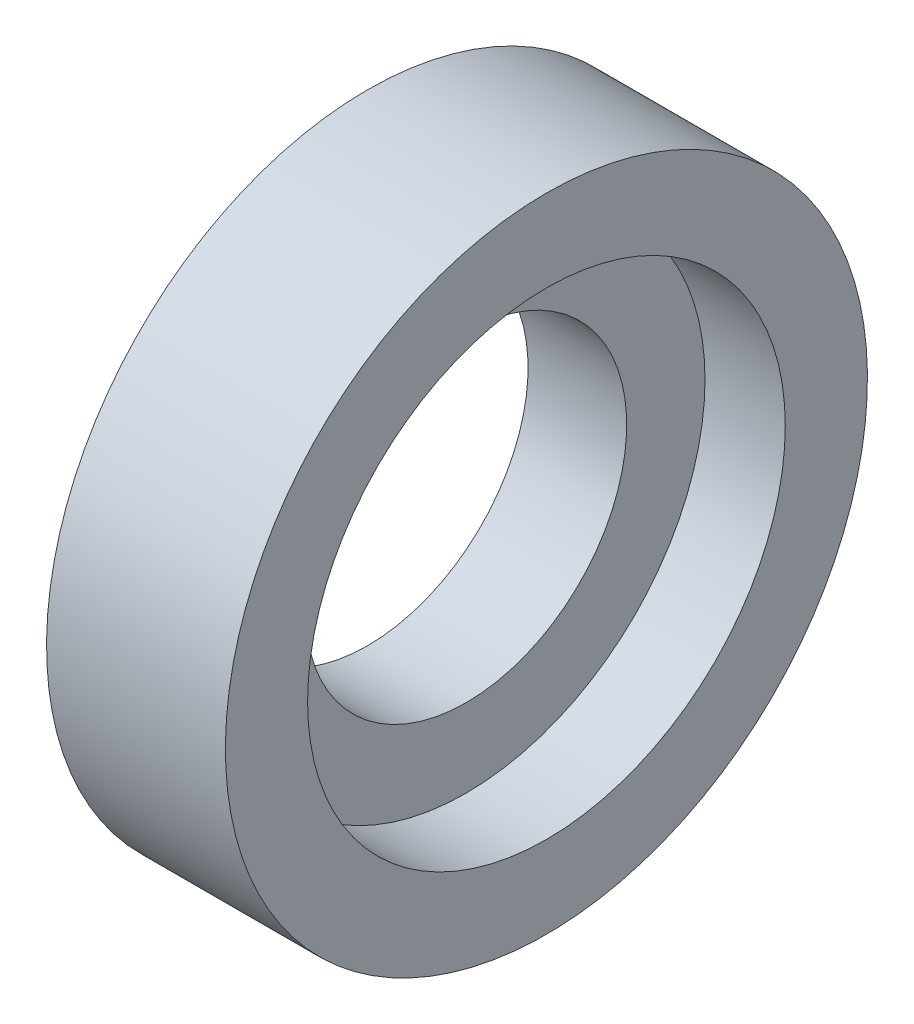
ISO-10303-21;
HEADER;
FILE_DESCRIPTION(('STEP AP214'),'2;1');
FILE_NAME('part.step','',(''),(''),'','','');
FILE_SCHEMA(('AUTOMOTIVE_DESIGN { 1 0 10303 214 1 1 1 1 }'));
ENDSEC;
DATA;
#1=APPLICATION_CONTEXT('core data for automotive mechanical design processes');
#2=APPLICATION_PROTOCOL_DEFINITION('international standard','automotive_design',2000,#1);
#3=PRODUCT_CONTEXT('',#1,'mechanical');
#4=PRODUCT('Part','Part','',(#3));
#5=PRODUCT_RELATED_PRODUCT_CATEGORY('part','',(#4));
#6=PRODUCT_DEFINITION_FORMATION('','',#4);
#7=PRODUCT_DEFINITION_CONTEXT('part definition',#1,'design');
#8=PRODUCT_DEFINITION('design','',#6,#7);
#9=PRODUCT_DEFINITION_SHAPE('','',#8);
#10=(LENGTH_UNIT() NAMED_UNIT(*) SI_UNIT(.MILLI.,.METRE.));
#11=(NAMED_UNIT(*) PLANE_ANGLE_UNIT() SI_UNIT($,.RADIAN.));
#12=(NAMED_UNIT(*) SI_UNIT($,.STERADIAN.) SOLID_ANGLE_UNIT());
#13=UNCERTAINTY_MEASURE_WITH_UNIT(LENGTH_MEASURE(1.E-05),#10,'distance_accuracy_value','');
#14=(GEOMETRIC_REPRESENTATION_CONTEXT(3) GLOBAL_UNCERTAINTY_ASSIGNED_CONTEXT((#13)) GLOBAL_UNIT_ASSIGNED_CONTEXT((#10,
#11,#12)) REPRESENTATION_CONTEXT('',''));
#15=CARTESIAN_POINT('',(0.,0.,0.));
#16=DIRECTION('',(0.,0.,1.));
#17=DIRECTION('',(1.,0.,0.));
#18=AXIS2_PLACEMENT_3D('',#15,#16,#17);
#19=CARTESIAN_POINT('',(3.90144,0.,0.));
#20=DIRECTION('',(1.,0.,0.));
#21=DIRECTION('',(0.,1.,0.));
#22=AXIS2_PLACEMENT_3D('',#19,#20,#21);
#23=CYLINDRICAL_SURFACE('',#22,9.4488);
#24=CARTESIAN_POINT('',(3.90143999999999,0.,0.));
#25=DIRECTION('',(1.,0.,0.));
#26=DIRECTION('',(0.,1.,0.));
#27=AXIS2_PLACEMENT_3D('',#24,#25,#26);
#28=CIRCLE('',#27,9.4488);
#29=CARTESIAN_POINT('',(3.90144,9.4488,0.));
#30=VERTEX_POINT('',#29);
#31=EDGE_CURVE('E63',#30,#30,#28,.T.);
#32=ORIENTED_EDGE('',*,*,#31,.F.);
#33=EDGE_LOOP('',(#32));
#34=FACE_BOUND('',#33,.T.);
#35=CARTESIAN_POINT('',(7.07643999999999,0.,0.));
#36=DIRECTION('',(1.,0.,0.));
#37=DIRECTION('',(0.,1.,0.));
#38=AXIS2_PLACEMENT_3D('',#35,#36,#37);
#39=CIRCLE('',#38,9.4488);
#40=CARTESIAN_POINT('',(7.07644,9.4488,0.));
#41=VERTEX_POINT('',#40);
#42=EDGE_CURVE('E10',#41,#41,#39,.T.);
#43=ORIENTED_EDGE('',*,*,#42,.T.);
#44=EDGE_LOOP('',(#43));
#45=FACE_BOUND('',#44,.T.);
#46=ADVANCED_FACE('F41',(#34,#45),#23,.F.);
#47=CARTESIAN_POINT('',(7.07643999999999,0.,0.));
#48=DIRECTION('',(-1.,0.,0.));
#49=DIRECTION('',(0.,-1.,0.));
#50=AXIS2_PLACEMENT_3D('',#47,#48,#49);
#51=PLANE('',#50);
#52=ORIENTED_EDGE('',*,*,#42,.F.);
#53=EDGE_LOOP('',(#52));
#54=FACE_BOUND('',#53,.T.);
#55=CARTESIAN_POINT('',(7.07643999999999,0.,0.));
#56=DIRECTION('',(1.,0.,0.));
#57=DIRECTION('',(0.,1.,0.));
#58=AXIS2_PLACEMENT_3D('',#55,#56,#57);
#59=CIRCLE('',#58,12.7);
#60=CARTESIAN_POINT('',(7.07644,12.7,0.));
#61=VERTEX_POINT('',#60);
#62=EDGE_CURVE('E47',#61,#61,#59,.T.);
#63=ORIENTED_EDGE('',*,*,#62,.T.);
#64=EDGE_LOOP('',(#63));
#65=FACE_BOUND('',#64,.T.);
#66=ADVANCED_FACE('F70',(#54,#65),#51,.F.);
#67=CARTESIAN_POINT('',(3.90144,0.,0.));
#68=DIRECTION('',(1.,0.,0.));
#69=DIRECTION('',(0.,1.,0.));
#70=AXIS2_PLACEMENT_3D('',#67,#68,#69);
#71=CYLINDRICAL_SURFACE('',#70,12.7);
#72=ORIENTED_EDGE('',*,*,#62,.F.);
#73=EDGE_LOOP('',(#72));
#74=FACE_BOUND('',#73,.T.);
#75=CARTESIAN_POINT('',(0.,0.,0.));
#76=DIRECTION('',(1.,0.,0.));
#77=DIRECTION('',(0.,1.,0.));
#78=AXIS2_PLACEMENT_3D('',#75,#76,#77);
#79=CIRCLE('',#78,12.7);
#80=CARTESIAN_POINT('',(0.,12.7,0.));
#81=VERTEX_POINT('',#80);
#82=EDGE_CURVE('E51',#81,#81,#79,.T.);
#83=ORIENTED_EDGE('',*,*,#82,.T.);
#84=EDGE_LOOP('',(#83));
#85=FACE_BOUND('',#84,.T.);
#86=ADVANCED_FACE('F74',(#74,#85),#71,.T.);
#87=CARTESIAN_POINT('',(0.,0.,0.));
#88=DIRECTION('',(1.,0.,0.));
#89=DIRECTION('',(0.,1.,0.));
#90=AXIS2_PLACEMENT_3D('',#87,#88,#89);
#91=PLANE('',#90);
#92=ORIENTED_EDGE('',*,*,#82,.F.);
#93=EDGE_LOOP('',(#92));
#94=FACE_BOUND('',#93,.T.);
#95=CARTESIAN_POINT('',(0.,0.,0.));
#96=DIRECTION('',(1.,0.,0.));
#97=DIRECTION('',(0.,1.,0.));
#98=AXIS2_PLACEMENT_3D('',#95,#96,#97);
#99=CIRCLE('',#98,6.35);
#100=CARTESIAN_POINT('',(0.,6.35,0.));
#101=VERTEX_POINT('',#100);
#102=EDGE_CURVE('E55',#101,#101,#99,.T.);
#103=ORIENTED_EDGE('',*,*,#102,.T.);
#104=EDGE_LOOP('',(#103));
#105=FACE_BOUND('',#104,.T.);
#106=ADVANCED_FACE('F79',(#94,#105),#91,.F.);
#107=CARTESIAN_POINT('',(3.90144,0.,0.));
#108=DIRECTION('',(1.,0.,0.));
#109=DIRECTION('',(0.,1.,0.));
#110=AXIS2_PLACEMENT_3D('',#107,#108,#109);
#111=CYLINDRICAL_SURFACE('',#110,6.35);
#112=ORIENTED_EDGE('',*,*,#102,.F.);
#113=EDGE_LOOP('',(#112));
#114=FACE_BOUND('',#113,.T.);
#115=CARTESIAN_POINT('',(3.90143999999999,0.,0.));
#116=DIRECTION('',(1.,0.,0.));
#117=DIRECTION('',(0.,1.,0.));
#118=AXIS2_PLACEMENT_3D('',#115,#116,#117);
#119=CIRCLE('',#118,6.35);
#120=CARTESIAN_POINT('',(3.90144,6.35,0.));
#121=VERTEX_POINT('',#120);
#122=EDGE_CURVE('E60',#121,#121,#119,.T.);
#123=ORIENTED_EDGE('',*,*,#122,.T.);
#124=EDGE_LOOP('',(#123));
#125=FACE_BOUND('',#124,.T.);
#126=ADVANCED_FACE('F85',(#114,#125),#111,.F.);
#127=CARTESIAN_POINT('',(3.90143999999999,0.,0.));
#128=DIRECTION('',(-1.,0.,0.));
#129=DIRECTION('',(0.,-1.,0.));
#130=AXIS2_PLACEMENT_3D('',#127,#128,#129);
#131=PLANE('',#130);
#132=ORIENTED_EDGE('',*,*,#122,.F.);
#133=EDGE_LOOP('',(#132));
#134=FACE_BOUND('',#133,.T.);
#135=ORIENTED_EDGE('',*,*,#31,.T.);
#136=EDGE_LOOP('',(#135));
#137=FACE_BOUND('',#136,.T.);
#138=ADVANCED_FACE('F67',(#134,#137),#131,.F.);
#139=CLOSED_SHELL('',(#46,#66,#86,#106,#126,#138));
#140=MANIFOLD_SOLID_BREP('B2',#139);
#141=ADVANCED_BREP_SHAPE_REPRESENTATION('',(#18,#140),#14);
#142=SHAPE_DEFINITION_REPRESENTATION(#9,#141);
ENDSEC;
END-ISO-10303-21;
